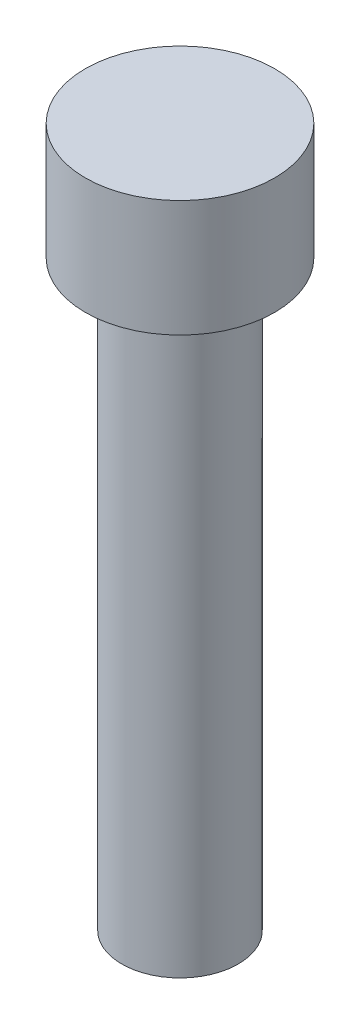
ISO-10303-21;
HEADER;
FILE_DESCRIPTION(('STEP AP214'),'2;1');
FILE_NAME('part.step','',(''),(''),'','','');
FILE_SCHEMA(('AUTOMOTIVE_DESIGN { 1 0 10303 214 1 1 1 1 }'));
ENDSEC;
DATA;
#1=APPLICATION_CONTEXT('core data for automotive mechanical design processes');
#2=APPLICATION_PROTOCOL_DEFINITION('international standard','automotive_design',2000,#1);
#3=PRODUCT_CONTEXT('',#1,'mechanical');
#4=PRODUCT('Part','Part','',(#3));
#5=PRODUCT_RELATED_PRODUCT_CATEGORY('part','',(#4));
#6=PRODUCT_DEFINITION_FORMATION('','',#4);
#7=PRODUCT_DEFINITION_CONTEXT('part definition',#1,'design');
#8=PRODUCT_DEFINITION('design','',#6,#7);
#9=PRODUCT_DEFINITION_SHAPE('','',#8);
#10=(LENGTH_UNIT() NAMED_UNIT(*) SI_UNIT(.MILLI.,.METRE.));
#11=(NAMED_UNIT(*) PLANE_ANGLE_UNIT() SI_UNIT($,.RADIAN.));
#12=(NAMED_UNIT(*) SI_UNIT($,.STERADIAN.) SOLID_ANGLE_UNIT());
#13=UNCERTAINTY_MEASURE_WITH_UNIT(LENGTH_MEASURE(1.E-05),#10,'distance_accuracy_value','');
#14=(GEOMETRIC_REPRESENTATION_CONTEXT(3) GLOBAL_UNCERTAINTY_ASSIGNED_CONTEXT((#13)) GLOBAL_UNIT_ASSIGNED_CONTEXT((#10,
#11,#12)) REPRESENTATION_CONTEXT('',''));
#15=CARTESIAN_POINT('',(0.,0.,0.));
#16=DIRECTION('',(0.,0.,1.));
#17=DIRECTION('',(1.,0.,0.));
#18=AXIS2_PLACEMENT_3D('',#15,#16,#17);
#19=CARTESIAN_POINT('',(4.00000000000001,0.,0.));
#20=DIRECTION('',(0.,-1.,0.));
#21=DIRECTION('',(0.,0.,-1.));
#22=AXIS2_PLACEMENT_3D('',#19,#20,#21);
#23=PLANE('',#22);
#24=CARTESIAN_POINT('',(0.,0.,0.));
#25=DIRECTION('',(0.,-1.,0.));
#26=DIRECTION('',(0.,0.,-1.));
#27=AXIS2_PLACEMENT_3D('',#24,#25,#26);
#28=CIRCLE('',#27,4.00000000000001);
#29=CARTESIAN_POINT('',(0.,0.,-4.00000000000001));
#30=VERTEX_POINT('',#29);
#31=EDGE_CURVE('E45',#30,#30,#28,.T.);
#32=ORIENTED_EDGE('',*,*,#31,.T.);
#33=EDGE_LOOP('',(#32));
#34=FACE_BOUND('',#33,.T.);
#35=ADVANCED_FACE('F31',(#34),#23,.T.);
#36=CARTESIAN_POINT('',(0.,48.,0.));
#37=DIRECTION('',(0.,1.,0.));
#38=DIRECTION('',(0.,0.,1.));
#39=AXIS2_PLACEMENT_3D('',#36,#37,#38);
#40=PLANE('',#39);
#41=CARTESIAN_POINT('',(0.,48.,0.));
#42=DIRECTION('',(0.,-1.,0.));
#43=DIRECTION('',(0.,0.,-1.));
#44=AXIS2_PLACEMENT_3D('',#41,#42,#43);
#45=CIRCLE('',#44,6.5);
#46=CARTESIAN_POINT('',(0.,48.,-6.5));
#47=VERTEX_POINT('',#46);
#48=EDGE_CURVE('E10',#47,#47,#45,.T.);
#49=ORIENTED_EDGE('',*,*,#48,.F.);
#50=EDGE_LOOP('',(#49));
#51=FACE_BOUND('',#50,.T.);
#52=ADVANCED_FACE('F63',(#51),#40,.T.);
#53=CARTESIAN_POINT('',(0.,0.,0.));
#54=DIRECTION('',(0.,-1.,0.));
#55=DIRECTION('',(0.,0.,-1.));
#56=AXIS2_PLACEMENT_3D('',#53,#54,#55);
#57=CYLINDRICAL_SURFACE('',#56,6.5);
#58=ORIENTED_EDGE('',*,*,#48,.T.);
#59=EDGE_LOOP('',(#58));
#60=FACE_BOUND('',#59,.T.);
#61=CARTESIAN_POINT('',(0.,40.,0.));
#62=DIRECTION('',(0.,-1.,0.));
#63=DIRECTION('',(0.,0.,-1.));
#64=AXIS2_PLACEMENT_3D('',#61,#62,#63);
#65=CIRCLE('',#64,6.5);
#66=CARTESIAN_POINT('',(0.,40.,-6.5));
#67=VERTEX_POINT('',#66);
#68=EDGE_CURVE('E37',#67,#67,#65,.T.);
#69=ORIENTED_EDGE('',*,*,#68,.F.);
#70=EDGE_LOOP('',(#69));
#71=FACE_BOUND('',#70,.T.);
#72=ADVANCED_FACE('F60',(#60,#71),#57,.T.);
#73=CARTESIAN_POINT('',(6.5,40.,0.));
#74=DIRECTION('',(0.,-1.,0.));
#75=DIRECTION('',(0.,0.,-1.));
#76=AXIS2_PLACEMENT_3D('',#73,#74,#75);
#77=PLANE('',#76);
#78=ORIENTED_EDGE('',*,*,#68,.T.);
#79=EDGE_LOOP('',(#78));
#80=FACE_BOUND('',#79,.T.);
#81=CARTESIAN_POINT('',(0.,40.,0.));
#82=DIRECTION('',(0.,-1.,0.));
#83=DIRECTION('',(0.,0.,-1.));
#84=AXIS2_PLACEMENT_3D('',#81,#82,#83);
#85=CIRCLE('',#84,4.);
#86=CARTESIAN_POINT('',(0.,40.,-4.));
#87=VERTEX_POINT('',#86);
#88=EDGE_CURVE('E41',#87,#87,#85,.T.);
#89=ORIENTED_EDGE('',*,*,#88,.F.);
#90=EDGE_LOOP('',(#89));
#91=FACE_BOUND('',#90,.T.);
#92=ADVANCED_FACE('F54',(#80,#91),#77,.T.);
#93=CARTESIAN_POINT('',(0.,0.,0.));
#94=DIRECTION('',(0.,-1.,0.));
#95=DIRECTION('',(0.,0.,-1.));
#96=AXIS2_PLACEMENT_3D('',#93,#94,#95);
#97=CYLINDRICAL_SURFACE('',#96,4.);
#98=ORIENTED_EDGE('',*,*,#88,.T.);
#99=EDGE_LOOP('',(#98));
#100=FACE_BOUND('',#99,.T.);
#101=ORIENTED_EDGE('',*,*,#31,.F.);
#102=EDGE_LOOP('',(#101));
#103=FACE_BOUND('',#102,.T.);
#104=ADVANCED_FACE('F52',(#100,#103),#97,.T.);
#105=CLOSED_SHELL('',(#35,#52,#72,#92,#104));
#106=MANIFOLD_SOLID_BREP('B2',#105);
#107=ADVANCED_BREP_SHAPE_REPRESENTATION('',(#18,#106),#14);
#108=SHAPE_DEFINITION_REPRESENTATION(#9,#107);
ENDSEC;
END-ISO-10303-21;
